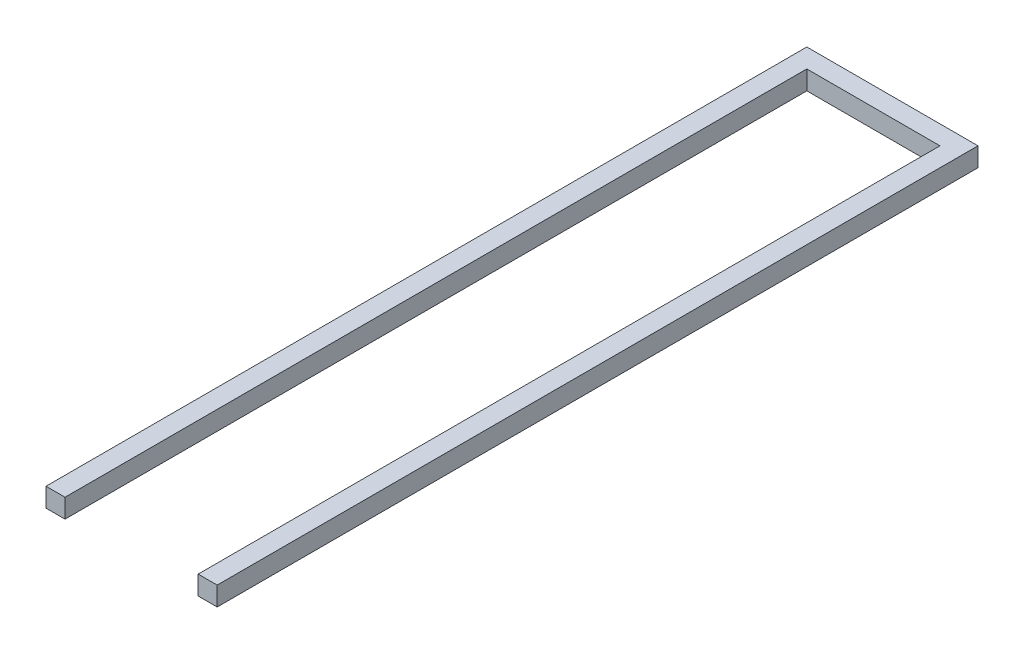
ISO-10303-21;
HEADER;
FILE_DESCRIPTION(('STEP AP214'),'2;1');
FILE_NAME('part.step','',(''),(''),'','','');
FILE_SCHEMA(('AUTOMOTIVE_DESIGN { 1 0 10303 214 1 1 1 1 }'));
ENDSEC;
DATA;
#1=APPLICATION_CONTEXT('core data for automotive mechanical design processes');
#2=APPLICATION_PROTOCOL_DEFINITION('international standard','automotive_design',2000,#1);
#3=PRODUCT_CONTEXT('',#1,'mechanical');
#4=PRODUCT('Part','Part','',(#3));
#5=PRODUCT_RELATED_PRODUCT_CATEGORY('part','',(#4));
#6=PRODUCT_DEFINITION_FORMATION('','',#4);
#7=PRODUCT_DEFINITION_CONTEXT('part definition',#1,'design');
#8=PRODUCT_DEFINITION('design','',#6,#7);
#9=PRODUCT_DEFINITION_SHAPE('','',#8);
#10=(LENGTH_UNIT() NAMED_UNIT(*) SI_UNIT(.MILLI.,.METRE.));
#11=(NAMED_UNIT(*) PLANE_ANGLE_UNIT() SI_UNIT($,.RADIAN.));
#12=(NAMED_UNIT(*) SI_UNIT($,.STERADIAN.) SOLID_ANGLE_UNIT());
#13=UNCERTAINTY_MEASURE_WITH_UNIT(LENGTH_MEASURE(1.E-05),#10,'distance_accuracy_value','');
#14=(GEOMETRIC_REPRESENTATION_CONTEXT(3) GLOBAL_UNCERTAINTY_ASSIGNED_CONTEXT((#13)) GLOBAL_UNIT_ASSIGNED_CONTEXT((#10,
#11,#12)) REPRESENTATION_CONTEXT('',''));
#15=CARTESIAN_POINT('',(0.,0.,0.));
#16=DIRECTION('',(0.,0.,1.));
#17=DIRECTION('',(1.,0.,0.));
#18=AXIS2_PLACEMENT_3D('',#15,#16,#17);
#19=CARTESIAN_POINT('',(0.,0.,50.));
#20=DIRECTION('',(0.,0.,-1.));
#21=DIRECTION('',(-1.,0.,0.));
#22=AXIS2_PLACEMENT_3D('',#19,#20,#21);
#23=PLANE('',#22);
#24=DIRECTION('',(0.,-1.,0.));
#25=VECTOR('',#24,1.);
#26=CARTESIAN_POINT('',(175.,0.,50.));
#27=LINE('',#26,#25);
#28=CARTESIAN_POINT('',(175.,25.,50.));
#29=VERTEX_POINT('',#28);
#30=CARTESIAN_POINT('',(175.,-25.,50.));
#31=VERTEX_POINT('',#30);
#32=EDGE_CURVE('E11',#29,#31,#27,.T.);
#33=ORIENTED_EDGE('',*,*,#32,.F.);
#34=DIRECTION('',(-1.,0.,0.));
#35=VECTOR('',#34,1.);
#36=CARTESIAN_POINT('',(-200.,25.,50.));
#37=LINE('',#36,#35);
#38=CARTESIAN_POINT('',(-175.,25.,50.));
#39=VERTEX_POINT('',#38);
#40=EDGE_CURVE('E127',#29,#39,#37,.T.);
#41=ORIENTED_EDGE('',*,*,#40,.T.);
#42=DIRECTION('',(0.,-1.,0.));
#43=VECTOR('',#42,1.);
#44=CARTESIAN_POINT('',(-175.,-25.,50.));
#45=LINE('',#44,#43);
#46=CARTESIAN_POINT('',(-175.,-25.,50.));
#47=VERTEX_POINT('',#46);
#48=EDGE_CURVE('E135',#39,#47,#45,.T.);
#49=ORIENTED_EDGE('',*,*,#48,.T.);
#50=DIRECTION('',(1.,0.,0.));
#51=VECTOR('',#50,1.);
#52=CARTESIAN_POINT('',(-200.,-25.,50.));
#53=LINE('',#52,#51);
#54=EDGE_CURVE('E56',#47,#31,#53,.T.);
#55=ORIENTED_EDGE('',*,*,#54,.T.);
#56=EDGE_LOOP('',(#33,#41,#49,#55));
#57=FACE_BOUND('',#56,.T.);
#58=ADVANCED_FACE('F41',(#57),#23,.F.);
#59=CARTESIAN_POINT('',(-175.,-25.,2000.));
#60=DIRECTION('',(-1.,0.,0.));
#61=DIRECTION('',(0.,0.,1.));
#62=AXIS2_PLACEMENT_3D('',#59,#60,#61);
#63=PLANE('',#62);
#64=ORIENTED_EDGE('',*,*,#48,.F.);
#65=DIRECTION('',(0.,0.,-1.));
#66=VECTOR('',#65,1.);
#67=CARTESIAN_POINT('',(-175.,25.,2000.));
#68=LINE('',#67,#66);
#69=CARTESIAN_POINT('',(-175.,25.,2000.));
#70=VERTEX_POINT('',#69);
#71=EDGE_CURVE('E49',#70,#39,#68,.T.);
#72=ORIENTED_EDGE('',*,*,#71,.F.);
#73=DIRECTION('',(0.,1.,0.));
#74=VECTOR('',#73,1.);
#75=CARTESIAN_POINT('',(-175.,-25.,2000.));
#76=LINE('',#75,#74);
#77=CARTESIAN_POINT('',(-175.,-25.,2000.));
#78=VERTEX_POINT('',#77);
#79=EDGE_CURVE('E138',#78,#70,#76,.T.);
#80=ORIENTED_EDGE('',*,*,#79,.F.);
#81=DIRECTION('',(0.,0.,-1.));
#82=VECTOR('',#81,1.);
#83=CARTESIAN_POINT('',(-175.,-25.,2000.));
#84=LINE('',#83,#82);
#85=EDGE_CURVE('E148',#78,#47,#84,.T.);
#86=ORIENTED_EDGE('',*,*,#85,.T.);
#87=EDGE_LOOP('',(#64,#72,#80,#86));
#88=FACE_BOUND('',#87,.T.);
#89=ADVANCED_FACE('F43',(#88),#63,.F.);
#90=CARTESIAN_POINT('',(-225.,25.,2000.));
#91=DIRECTION('',(0.,-1.,0.));
#92=DIRECTION('',(0.,0.,-1.));
#93=AXIS2_PLACEMENT_3D('',#90,#91,#92);
#94=PLANE('',#93);
#95=DIRECTION('',(-1.,0.,0.));
#96=VECTOR('',#95,1.);
#97=CARTESIAN_POINT('',(-225.,25.,0.));
#98=LINE('',#97,#96);
#99=CARTESIAN_POINT('',(225.,25.,0.));
#100=VERTEX_POINT('',#99);
#101=CARTESIAN_POINT('',(-225.,25.,0.));
#102=VERTEX_POINT('',#101);
#103=EDGE_CURVE('E137',#100,#102,#98,.T.);
#104=ORIENTED_EDGE('',*,*,#103,.T.);
#105=DIRECTION('',(0.,0.,-1.));
#106=VECTOR('',#105,1.);
#107=CARTESIAN_POINT('',(-225.,25.,2000.));
#108=LINE('',#107,#106);
#109=CARTESIAN_POINT('',(-225.,25.,2000.));
#110=VERTEX_POINT('',#109);
#111=EDGE_CURVE('E157',#110,#102,#108,.T.);
#112=ORIENTED_EDGE('',*,*,#111,.F.);
#113=DIRECTION('',(-1.,0.,0.));
#114=VECTOR('',#113,1.);
#115=CARTESIAN_POINT('',(-225.,25.,2000.));
#116=LINE('',#115,#114);
#117=EDGE_CURVE('E141',#70,#110,#116,.T.);
#118=ORIENTED_EDGE('',*,*,#117,.F.);
#119=ORIENTED_EDGE('',*,*,#71,.T.);
#120=ORIENTED_EDGE('',*,*,#40,.F.);
#121=DIRECTION('',(0.,0.,-1.));
#122=VECTOR('',#121,1.);
#123=CARTESIAN_POINT('',(175.,25.,2000.));
#124=LINE('',#123,#122);
#125=CARTESIAN_POINT('',(175.,25.,2000.));
#126=VERTEX_POINT('',#125);
#127=EDGE_CURVE('E110',#126,#29,#124,.T.);
#128=ORIENTED_EDGE('',*,*,#127,.F.);
#129=DIRECTION('',(-1.,0.,0.));
#130=VECTOR('',#129,1.);
#131=CARTESIAN_POINT('',(175.,25.,2000.));
#132=LINE('',#131,#130);
#133=CARTESIAN_POINT('',(225.,25.,2000.));
#134=VERTEX_POINT('',#133);
#135=EDGE_CURVE('E103',#134,#126,#132,.T.);
#136=ORIENTED_EDGE('',*,*,#135,.F.);
#137=DIRECTION('',(0.,0.,-1.));
#138=VECTOR('',#137,1.);
#139=CARTESIAN_POINT('',(225.,25.,2000.));
#140=LINE('',#139,#138);
#141=EDGE_CURVE('E107',#134,#100,#140,.T.);
#142=ORIENTED_EDGE('',*,*,#141,.T.);
#143=EDGE_LOOP('',(#104,#112,#118,#119,#120,#128,#136,#142));
#144=FACE_BOUND('',#143,.T.);
#145=ADVANCED_FACE('F105',(#144),#94,.F.);
#146=CARTESIAN_POINT('',(-225.,-25.,2000.));
#147=DIRECTION('',(1.,0.,0.));
#148=DIRECTION('',(0.,0.,-1.));
#149=AXIS2_PLACEMENT_3D('',#146,#147,#148);
#150=PLANE('',#149);
#151=DIRECTION('',(0.,-1.,0.));
#152=VECTOR('',#151,1.);
#153=CARTESIAN_POINT('',(-225.,-25.,0.));
#154=LINE('',#153,#152);
#155=CARTESIAN_POINT('',(-225.,-25.,0.));
#156=VERTEX_POINT('',#155);
#157=EDGE_CURVE('E150',#102,#156,#154,.T.);
#158=ORIENTED_EDGE('',*,*,#157,.T.);
#159=DIRECTION('',(0.,0.,-1.));
#160=VECTOR('',#159,1.);
#161=CARTESIAN_POINT('',(-225.,-25.,2000.));
#162=LINE('',#161,#160);
#163=CARTESIAN_POINT('',(-225.,-25.,2000.));
#164=VERTEX_POINT('',#163);
#165=EDGE_CURVE('E154',#164,#156,#162,.T.);
#166=ORIENTED_EDGE('',*,*,#165,.F.);
#167=DIRECTION('',(0.,-1.,0.));
#168=VECTOR('',#167,1.);
#169=CARTESIAN_POINT('',(-225.,-25.,2000.));
#170=LINE('',#169,#168);
#171=EDGE_CURVE('E144',#110,#164,#170,.T.);
#172=ORIENTED_EDGE('',*,*,#171,.F.);
#173=ORIENTED_EDGE('',*,*,#111,.T.);
#174=EDGE_LOOP('',(#158,#166,#172,#173));
#175=FACE_BOUND('',#174,.T.);
#176=ADVANCED_FACE('F201',(#175),#150,.F.);
#177=CARTESIAN_POINT('',(-225.,-25.,2000.));
#178=DIRECTION('',(0.,1.,0.));
#179=DIRECTION('',(0.,0.,1.));
#180=AXIS2_PLACEMENT_3D('',#177,#178,#179);
#181=PLANE('',#180);
#182=DIRECTION('',(1.,0.,0.));
#183=VECTOR('',#182,1.);
#184=CARTESIAN_POINT('',(-225.,-25.,0.));
#185=LINE('',#184,#183);
#186=CARTESIAN_POINT('',(225.,-25.,0.));
#187=VERTEX_POINT('',#186);
#188=EDGE_CURVE('E142',#156,#187,#185,.T.);
#189=ORIENTED_EDGE('',*,*,#188,.T.);
#190=DIRECTION('',(0.,0.,-1.));
#191=VECTOR('',#190,1.);
#192=CARTESIAN_POINT('',(225.,-25.,2000.));
#193=LINE('',#192,#191);
#194=CARTESIAN_POINT('',(225.,-25.,2000.));
#195=VERTEX_POINT('',#194);
#196=EDGE_CURVE('E172',#195,#187,#193,.T.);
#197=ORIENTED_EDGE('',*,*,#196,.F.);
#198=DIRECTION('',(1.,0.,0.));
#199=VECTOR('',#198,1.);
#200=CARTESIAN_POINT('',(175.,-25.,2000.));
#201=LINE('',#200,#199);
#202=CARTESIAN_POINT('',(175.,-25.,2000.));
#203=VERTEX_POINT('',#202);
#204=EDGE_CURVE('E119',#203,#195,#201,.T.);
#205=ORIENTED_EDGE('',*,*,#204,.F.);
#206=DIRECTION('',(0.,0.,-1.));
#207=VECTOR('',#206,1.);
#208=CARTESIAN_POINT('',(175.,-25.,2000.));
#209=LINE('',#208,#207);
#210=EDGE_CURVE('E130',#203,#31,#209,.T.);
#211=ORIENTED_EDGE('',*,*,#210,.T.);
#212=ORIENTED_EDGE('',*,*,#54,.F.);
#213=ORIENTED_EDGE('',*,*,#85,.F.);
#214=DIRECTION('',(1.,0.,0.));
#215=VECTOR('',#214,1.);
#216=CARTESIAN_POINT('',(-225.,-25.,2000.));
#217=LINE('',#216,#215);
#218=EDGE_CURVE('E146',#164,#78,#217,.T.);
#219=ORIENTED_EDGE('',*,*,#218,.F.);
#220=ORIENTED_EDGE('',*,*,#165,.T.);
#221=EDGE_LOOP('',(#189,#197,#205,#211,#212,#213,#219,#220));
#222=FACE_BOUND('',#221,.T.);
#223=ADVANCED_FACE('F168',(#222),#181,.F.);
#224=CARTESIAN_POINT('',(0.,0.,2000.));
#225=DIRECTION('',(0.,0.,-1.));
#226=DIRECTION('',(-1.,0.,0.));
#227=AXIS2_PLACEMENT_3D('',#224,#225,#226);
#228=PLANE('',#227);
#229=ORIENTED_EDGE('',*,*,#79,.T.);
#230=ORIENTED_EDGE('',*,*,#117,.T.);
#231=ORIENTED_EDGE('',*,*,#171,.T.);
#232=ORIENTED_EDGE('',*,*,#218,.T.);
#233=EDGE_LOOP('',(#229,#230,#231,#232));
#234=FACE_BOUND('',#233,.T.);
#235=ADVANCED_FACE('F187',(#234),#228,.F.);
#236=CARTESIAN_POINT('',(0.,0.,0.));
#237=DIRECTION('',(0.,0.,-1.));
#238=DIRECTION('',(-1.,0.,0.));
#239=AXIS2_PLACEMENT_3D('',#236,#237,#238);
#240=PLANE('',#239);
#241=ORIENTED_EDGE('',*,*,#157,.F.);
#242=ORIENTED_EDGE('',*,*,#103,.F.);
#243=DIRECTION('',(0.,1.,0.));
#244=VECTOR('',#243,1.);
#245=CARTESIAN_POINT('',(225.,-25.,0.));
#246=LINE('',#245,#244);
#247=EDGE_CURVE('E123',#187,#100,#246,.T.);
#248=ORIENTED_EDGE('',*,*,#247,.F.);
#249=ORIENTED_EDGE('',*,*,#188,.F.);
#250=EDGE_LOOP('',(#241,#242,#248,#249));
#251=FACE_BOUND('',#250,.T.);
#252=ADVANCED_FACE('F179',(#251),#240,.T.);
#253=CARTESIAN_POINT('',(175.,-25.,2000.));
#254=DIRECTION('',(1.,0.,0.));
#255=DIRECTION('',(0.,0.,-1.));
#256=AXIS2_PLACEMENT_3D('',#253,#254,#255);
#257=PLANE('',#256);
#258=ORIENTED_EDGE('',*,*,#127,.T.);
#259=ORIENTED_EDGE('',*,*,#32,.T.);
#260=ORIENTED_EDGE('',*,*,#210,.F.);
#261=DIRECTION('',(0.,-1.,0.));
#262=VECTOR('',#261,1.);
#263=CARTESIAN_POINT('',(175.,-25.,2000.));
#264=LINE('',#263,#262);
#265=EDGE_CURVE('E113',#126,#203,#264,.T.);
#266=ORIENTED_EDGE('',*,*,#265,.F.);
#267=EDGE_LOOP('',(#258,#259,#260,#266));
#268=FACE_BOUND('',#267,.T.);
#269=ADVANCED_FACE('F177',(#268),#257,.F.);
#270=CARTESIAN_POINT('',(225.,-25.,2000.));
#271=DIRECTION('',(-1.,0.,0.));
#272=DIRECTION('',(0.,0.,1.));
#273=AXIS2_PLACEMENT_3D('',#270,#271,#272);
#274=PLANE('',#273);
#275=ORIENTED_EDGE('',*,*,#247,.T.);
#276=ORIENTED_EDGE('',*,*,#141,.F.);
#277=DIRECTION('',(0.,1.,0.));
#278=VECTOR('',#277,1.);
#279=CARTESIAN_POINT('',(225.,-25.,2000.));
#280=LINE('',#279,#278);
#281=EDGE_CURVE('E114',#195,#134,#280,.T.);
#282=ORIENTED_EDGE('',*,*,#281,.F.);
#283=ORIENTED_EDGE('',*,*,#196,.T.);
#284=EDGE_LOOP('',(#275,#276,#282,#283));
#285=FACE_BOUND('',#284,.T.);
#286=ADVANCED_FACE('F125',(#285),#274,.F.);
#287=CARTESIAN_POINT('',(0.,0.,2000.));
#288=DIRECTION('',(0.,0.,-1.));
#289=DIRECTION('',(-1.,0.,0.));
#290=AXIS2_PLACEMENT_3D('',#287,#288,#289);
#291=PLANE('',#290);
#292=ORIENTED_EDGE('',*,*,#281,.T.);
#293=ORIENTED_EDGE('',*,*,#135,.T.);
#294=ORIENTED_EDGE('',*,*,#265,.T.);
#295=ORIENTED_EDGE('',*,*,#204,.T.);
#296=EDGE_LOOP('',(#292,#293,#294,#295));
#297=FACE_BOUND('',#296,.T.);
#298=ADVANCED_FACE('F117',(#297),#291,.F.);
#299=CLOSED_SHELL('',(#58,#89,#145,#176,#223,#235,#252,#269,#286,#298));
#300=MANIFOLD_SOLID_BREP('B2',#299);
#301=ADVANCED_BREP_SHAPE_REPRESENTATION('',(#18,#300),#14);
#302=SHAPE_DEFINITION_REPRESENTATION(#9,#301);
ENDSEC;
END-ISO-10303-21;
